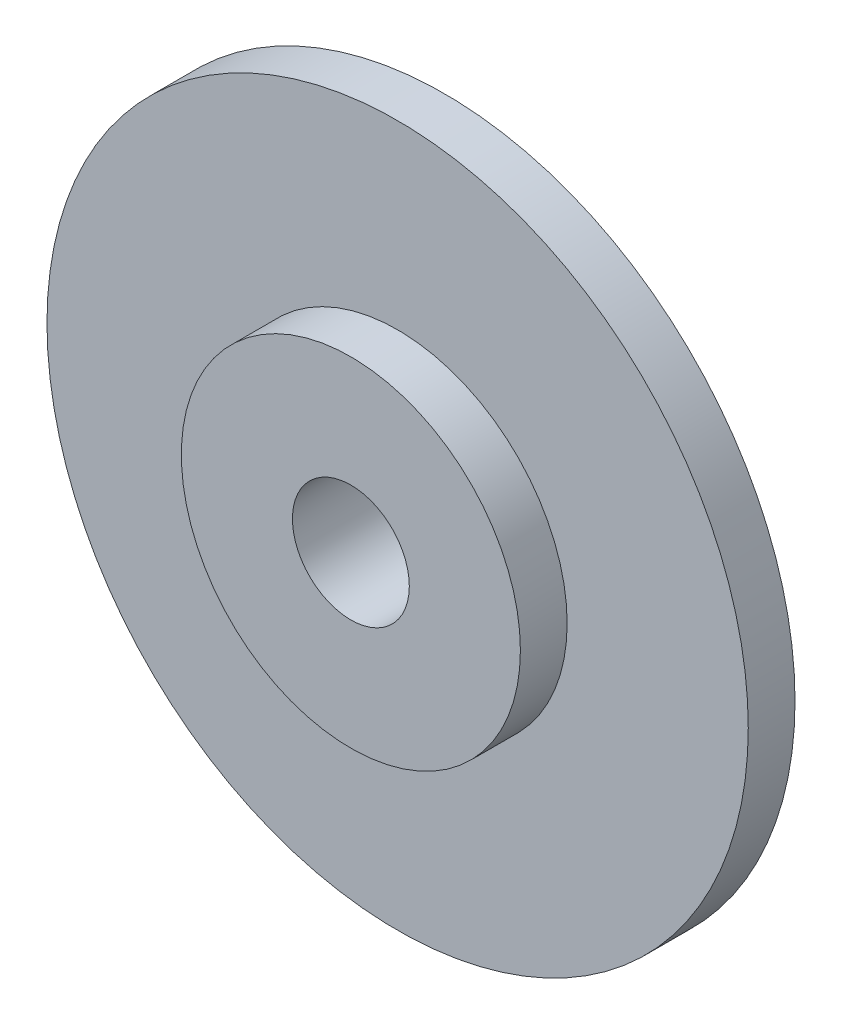
ISO-10303-21;
HEADER;
FILE_DESCRIPTION(('STEP AP214'),'2;1');
FILE_NAME('part.step','',(''),(''),'','','');
FILE_SCHEMA(('AUTOMOTIVE_DESIGN { 1 0 10303 214 1 1 1 1 }'));
ENDSEC;
DATA;
#1=APPLICATION_CONTEXT('core data for automotive mechanical design processes');
#2=APPLICATION_PROTOCOL_DEFINITION('international standard','automotive_design',2000,#1);
#3=PRODUCT_CONTEXT('',#1,'mechanical');
#4=PRODUCT('Part','Part','',(#3));
#5=PRODUCT_RELATED_PRODUCT_CATEGORY('part','',(#4));
#6=PRODUCT_DEFINITION_FORMATION('','',#4);
#7=PRODUCT_DEFINITION_CONTEXT('part definition',#1,'design');
#8=PRODUCT_DEFINITION('design','',#6,#7);
#9=PRODUCT_DEFINITION_SHAPE('','',#8);
#10=(LENGTH_UNIT() NAMED_UNIT(*) SI_UNIT(.MILLI.,.METRE.));
#11=(NAMED_UNIT(*) PLANE_ANGLE_UNIT() SI_UNIT($,.RADIAN.));
#12=(NAMED_UNIT(*) SI_UNIT($,.STERADIAN.) SOLID_ANGLE_UNIT());
#13=UNCERTAINTY_MEASURE_WITH_UNIT(LENGTH_MEASURE(1.E-05),#10,'distance_accuracy_value','');
#14=(GEOMETRIC_REPRESENTATION_CONTEXT(3) GLOBAL_UNCERTAINTY_ASSIGNED_CONTEXT((#13)) GLOBAL_UNIT_ASSIGNED_CONTEXT((#10,
#11,#12)) REPRESENTATION_CONTEXT('',''));
#15=CARTESIAN_POINT('',(0.,0.,0.));
#16=DIRECTION('',(0.,0.,1.));
#17=DIRECTION('',(1.,0.,0.));
#18=AXIS2_PLACEMENT_3D('',#15,#16,#17);
#19=CARTESIAN_POINT('',(0.,0.,0.));
#20=DIRECTION('',(0.,0.,1.));
#21=DIRECTION('',(1.,0.,0.));
#22=AXIS2_PLACEMENT_3D('',#19,#20,#21);
#23=PLANE('',#22);
#24=CARTESIAN_POINT('',(0.,0.,0.));
#25=DIRECTION('',(0.,0.,1.));
#26=DIRECTION('',(1.,0.,0.));
#27=AXIS2_PLACEMENT_3D('',#24,#25,#26);
#28=CIRCLE('',#27,47.625);
#29=CARTESIAN_POINT('',(47.625,0.,0.));
#30=VERTEX_POINT('',#29);
#31=EDGE_CURVE('E34',#30,#30,#28,.T.);
#32=ORIENTED_EDGE('',*,*,#31,.F.);
#33=EDGE_LOOP('',(#32));
#34=FACE_BOUND('',#33,.T.);
#35=CARTESIAN_POINT('',(0.,0.,0.));
#36=DIRECTION('',(0.,0.,1.));
#37=DIRECTION('',(1.,0.,0.));
#38=AXIS2_PLACEMENT_3D('',#35,#36,#37);
#39=CIRCLE('',#38,7.9375);
#40=CARTESIAN_POINT('',(7.9375,0.,0.));
#41=VERTEX_POINT('',#40);
#42=EDGE_CURVE('E49',#41,#41,#39,.T.);
#43=ORIENTED_EDGE('',*,*,#42,.T.);
#44=EDGE_LOOP('',(#43));
#45=FACE_BOUND('',#44,.T.);
#46=ADVANCED_FACE('F30',(#34,#45),#23,.F.);
#47=CARTESIAN_POINT('',(0.,0.,12.7));
#48=DIRECTION('',(0.,0.,1.));
#49=DIRECTION('',(1.,0.,0.));
#50=AXIS2_PLACEMENT_3D('',#47,#48,#49);
#51=PLANE('',#50);
#52=CARTESIAN_POINT('',(0.,0.,12.7));
#53=DIRECTION('',(0.,0.,1.));
#54=DIRECTION('',(1.,0.,0.));
#55=AXIS2_PLACEMENT_3D('',#52,#53,#54);
#56=CIRCLE('',#55,23.0251);
#57=CARTESIAN_POINT('',(23.0251,0.,12.7));
#58=VERTEX_POINT('',#57);
#59=EDGE_CURVE('E41',#58,#58,#56,.T.);
#60=ORIENTED_EDGE('',*,*,#59,.T.);
#61=EDGE_LOOP('',(#60));
#62=FACE_BOUND('',#61,.T.);
#63=CARTESIAN_POINT('',(0.,0.,12.7));
#64=DIRECTION('',(0.,0.,1.));
#65=DIRECTION('',(1.,0.,0.));
#66=AXIS2_PLACEMENT_3D('',#63,#64,#65);
#67=CIRCLE('',#66,7.9375);
#68=CARTESIAN_POINT('',(7.9375,0.,12.7));
#69=VERTEX_POINT('',#68);
#70=EDGE_CURVE('E46',#69,#69,#67,.T.);
#71=ORIENTED_EDGE('',*,*,#70,.F.);
#72=EDGE_LOOP('',(#71));
#73=FACE_BOUND('',#72,.T.);
#74=ADVANCED_FACE('F58',(#62,#73),#51,.T.);
#75=CARTESIAN_POINT('',(0.,0.,6.35));
#76=DIRECTION('',(0.,0.,1.));
#77=DIRECTION('',(1.,0.,0.));
#78=AXIS2_PLACEMENT_3D('',#75,#76,#77);
#79=PLANE('',#78);
#80=CARTESIAN_POINT('',(0.,0.,6.35));
#81=DIRECTION('',(0.,0.,1.));
#82=DIRECTION('',(1.,0.,0.));
#83=AXIS2_PLACEMENT_3D('',#80,#81,#82);
#84=CIRCLE('',#83,47.625);
#85=CARTESIAN_POINT('',(47.625,0.,6.35));
#86=VERTEX_POINT('',#85);
#87=EDGE_CURVE('E10',#86,#86,#84,.T.);
#88=ORIENTED_EDGE('',*,*,#87,.T.);
#89=EDGE_LOOP('',(#88));
#90=FACE_BOUND('',#89,.T.);
#91=CARTESIAN_POINT('',(0.,0.,6.35));
#92=DIRECTION('',(0.,0.,1.));
#93=DIRECTION('',(1.,0.,0.));
#94=AXIS2_PLACEMENT_3D('',#91,#92,#93);
#95=CIRCLE('',#94,23.0251);
#96=CARTESIAN_POINT('',(23.0251,0.,6.35));
#97=VERTEX_POINT('',#96);
#98=EDGE_CURVE('E43',#97,#97,#95,.T.);
#99=ORIENTED_EDGE('',*,*,#98,.F.);
#100=EDGE_LOOP('',(#99));
#101=FACE_BOUND('',#100,.T.);
#102=ADVANCED_FACE('F60',(#90,#101),#79,.T.);
#103=CARTESIAN_POINT('',(0.,0.,6.35));
#104=DIRECTION('',(0.,0.,-1.));
#105=DIRECTION('',(-1.,0.,0.));
#106=AXIS2_PLACEMENT_3D('',#103,#104,#105);
#107=CYLINDRICAL_SURFACE('',#106,47.625);
#108=ORIENTED_EDGE('',*,*,#87,.F.);
#109=EDGE_LOOP('',(#108));
#110=FACE_BOUND('',#109,.T.);
#111=ORIENTED_EDGE('',*,*,#31,.T.);
#112=EDGE_LOOP('',(#111));
#113=FACE_BOUND('',#112,.T.);
#114=ADVANCED_FACE('F32',(#110,#113),#107,.T.);
#115=CARTESIAN_POINT('',(0.,0.,12.7));
#116=DIRECTION('',(0.,0.,-1.));
#117=DIRECTION('',(-1.,0.,0.));
#118=AXIS2_PLACEMENT_3D('',#115,#116,#117);
#119=CYLINDRICAL_SURFACE('',#118,23.0251);
#120=ORIENTED_EDGE('',*,*,#59,.F.);
#121=EDGE_LOOP('',(#120));
#122=FACE_BOUND('',#121,.T.);
#123=ORIENTED_EDGE('',*,*,#98,.T.);
#124=EDGE_LOOP('',(#123));
#125=FACE_BOUND('',#124,.T.);
#126=ADVANCED_FACE('F71',(#122,#125),#119,.T.);
#127=CARTESIAN_POINT('',(0.,0.,12.7));
#128=DIRECTION('',(0.,0.,-1.));
#129=DIRECTION('',(-1.,0.,0.));
#130=AXIS2_PLACEMENT_3D('',#127,#128,#129);
#131=CYLINDRICAL_SURFACE('',#130,7.9375);
#132=ORIENTED_EDGE('',*,*,#70,.T.);
#133=EDGE_LOOP('',(#132));
#134=FACE_BOUND('',#133,.T.);
#135=ORIENTED_EDGE('',*,*,#42,.F.);
#136=EDGE_LOOP('',(#135));
#137=FACE_BOUND('',#136,.T.);
#138=ADVANCED_FACE('F55',(#134,#137),#131,.F.);
#139=CLOSED_SHELL('',(#46,#74,#102,#114,#126,#138));
#140=MANIFOLD_SOLID_BREP('B2',#139);
#141=ADVANCED_BREP_SHAPE_REPRESENTATION('',(#18,#140),#14);
#142=SHAPE_DEFINITION_REPRESENTATION(#9,#141);
ENDSEC;
END-ISO-10303-21;
